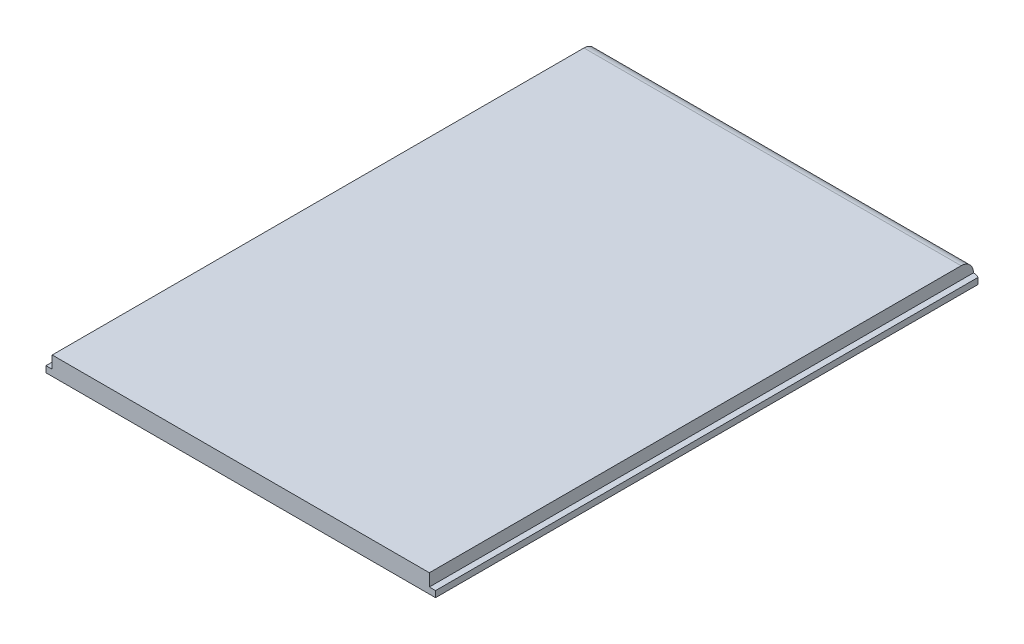
ISO-10303-21;
HEADER;
FILE_DESCRIPTION(('STEP AP214'),'2;1');
FILE_NAME('part.step','',(''),(''),'','','');
FILE_SCHEMA(('AUTOMOTIVE_DESIGN { 1 0 10303 214 1 1 1 1 }'));
ENDSEC;
DATA;
#1=APPLICATION_CONTEXT('core data for automotive mechanical design processes');
#2=APPLICATION_PROTOCOL_DEFINITION('international standard','automotive_design',2000,#1);
#3=PRODUCT_CONTEXT('',#1,'mechanical');
#4=PRODUCT('Part','Part','',(#3));
#5=PRODUCT_RELATED_PRODUCT_CATEGORY('part','',(#4));
#6=PRODUCT_DEFINITION_FORMATION('','',#4);
#7=PRODUCT_DEFINITION_CONTEXT('part definition',#1,'design');
#8=PRODUCT_DEFINITION('design','',#6,#7);
#9=PRODUCT_DEFINITION_SHAPE('','',#8);
#10=(LENGTH_UNIT() NAMED_UNIT(*) SI_UNIT(.MILLI.,.METRE.));
#11=(NAMED_UNIT(*) PLANE_ANGLE_UNIT() SI_UNIT($,.RADIAN.));
#12=(NAMED_UNIT(*) SI_UNIT($,.STERADIAN.) SOLID_ANGLE_UNIT());
#13=UNCERTAINTY_MEASURE_WITH_UNIT(LENGTH_MEASURE(1.E-05),#10,'distance_accuracy_value','');
#14=(GEOMETRIC_REPRESENTATION_CONTEXT(3) GLOBAL_UNCERTAINTY_ASSIGNED_CONTEXT((#13)) GLOBAL_UNIT_ASSIGNED_CONTEXT((#10,
#11,#12)) REPRESENTATION_CONTEXT('',''));
#15=CARTESIAN_POINT('',(0.,0.,0.));
#16=DIRECTION('',(0.,0.,1.));
#17=DIRECTION('',(1.,0.,0.));
#18=AXIS2_PLACEMENT_3D('',#15,#16,#17);
#19=CARTESIAN_POINT('',(-38.735,3.81,-55.88));
#20=DIRECTION('',(0.,0.,1.));
#21=DIRECTION('',(1.,0.,0.));
#22=AXIS2_PLACEMENT_3D('',#19,#20,#21);
#23=PLANE('',#22);
#24=DIRECTION('',(0.,1.,0.));
#25=VECTOR('',#24,1.);
#26=CARTESIAN_POINT('',(38.735,-0.00100000000000013,-55.88));
#27=LINE('',#26,#25);
#28=CARTESIAN_POINT('',(38.735,0.,-55.88));
#29=VERTEX_POINT('',#28);
#30=CARTESIAN_POINT('',(38.735,1.27000000000014,-55.88));
#31=VERTEX_POINT('',#30);
#32=EDGE_CURVE('E112',#29,#31,#27,.T.);
#33=ORIENTED_EDGE('',*,*,#32,.F.);
#34=DIRECTION('',(-1.,0.,0.));
#35=VECTOR('',#34,1.);
#36=CARTESIAN_POINT('',(-38.735,0.,-55.88));
#37=LINE('',#36,#35);
#38=CARTESIAN_POINT('',(-38.735,0.,-55.88));
#39=VERTEX_POINT('',#38);
#40=EDGE_CURVE('E122',#29,#39,#37,.T.);
#41=ORIENTED_EDGE('',*,*,#40,.T.);
#42=DIRECTION('',(0.,1.,0.));
#43=VECTOR('',#42,1.);
#44=CARTESIAN_POINT('',(-38.735,-0.00100000000000013,-55.88));
#45=LINE('',#44,#43);
#46=CARTESIAN_POINT('',(-38.735,1.27,-55.88));
#47=VERTEX_POINT('',#46);
#48=EDGE_CURVE('E178',#39,#47,#45,.T.);
#49=ORIENTED_EDGE('',*,*,#48,.T.);
#50=DIRECTION('',(-1.,0.,0.));
#51=VECTOR('',#50,1.);
#52=CARTESIAN_POINT('',(-38.735,1.27,-55.88));
#53=LINE('',#52,#51);
#54=EDGE_CURVE('E45',#47,#31,#53,.F.);
#55=ORIENTED_EDGE('',*,*,#54,.T.);
#56=EDGE_LOOP('',(#33,#41,#49,#55));
#57=FACE_BOUND('',#56,.T.);
#58=ADVANCED_FACE('F37',(#57),#23,.F.);
#59=CARTESIAN_POINT('',(0.,0.,0.));
#60=DIRECTION('',(0.,-1.,0.));
#61=DIRECTION('',(0.,0.,-1.));
#62=AXIS2_PLACEMENT_3D('',#59,#60,#61);
#63=PLANE('',#62);
#64=ORIENTED_EDGE('',*,*,#40,.F.);
#65=CARTESIAN_POINT('',(38.735,0.,-53.34));
#66=DIRECTION('',(0.,-1.,0.));
#67=DIRECTION('',(0.,0.,-1.));
#68=AXIS2_PLACEMENT_3D('',#65,#66,#67);
#69=CIRCLE('',#68,2.54);
#70=CARTESIAN_POINT('',(40.005,1.45554141656179E-13,-55.5397045256125));
#71=VERTEX_POINT('',#70);
#72=EDGE_CURVE('E107',#71,#29,#69,.F.);
#73=ORIENTED_EDGE('',*,*,#72,.F.);
#74=DIRECTION('',(0.,0.,1.));
#75=VECTOR('',#74,1.);
#76=CARTESIAN_POINT('',(40.005,1.45554141656179E-13,-57.6760512242138));
#77=LINE('',#76,#75);
#78=CARTESIAN_POINT('',(40.005,1.45554141656179E-13,55.88));
#79=VERTEX_POINT('',#78);
#80=EDGE_CURVE('E118',#71,#79,#77,.T.);
#81=ORIENTED_EDGE('',*,*,#80,.T.);
#82=DIRECTION('',(1.,0.,0.));
#83=VECTOR('',#82,1.);
#84=CARTESIAN_POINT('',(-38.735,0.,55.88));
#85=LINE('',#84,#83);
#86=CARTESIAN_POINT('',(-40.005,0.,55.88));
#87=VERTEX_POINT('',#86);
#88=EDGE_CURVE('E157',#87,#79,#85,.T.);
#89=ORIENTED_EDGE('',*,*,#88,.F.);
#90=DIRECTION('',(0.,0.,1.));
#91=VECTOR('',#90,1.);
#92=CARTESIAN_POINT('',(-40.005,0.,-57.6760512242138));
#93=LINE('',#92,#91);
#94=CARTESIAN_POINT('',(-40.005,0.,-55.5397045256125));
#95=VERTEX_POINT('',#94);
#96=EDGE_CURVE('E147',#95,#87,#93,.T.);
#97=ORIENTED_EDGE('',*,*,#96,.F.);
#98=CARTESIAN_POINT('',(-38.735,0.,-53.34));
#99=DIRECTION('',(0.,-1.,0.));
#100=DIRECTION('',(0.,0.,-1.));
#101=AXIS2_PLACEMENT_3D('',#98,#99,#100);
#102=CIRCLE('',#101,2.54);
#103=EDGE_CURVE('E199',#95,#39,#102,.T.);
#104=ORIENTED_EDGE('',*,*,#103,.T.);
#105=EDGE_LOOP('',(#64,#73,#81,#89,#97,#104));
#106=FACE_BOUND('',#105,.T.);
#107=ADVANCED_FACE('F116',(#106),#63,.T.);
#108=CARTESIAN_POINT('',(-38.735,1.27,-57.6760512242138));
#109=DIRECTION('',(0.,1.,0.));
#110=DIRECTION('',(0.,0.,1.));
#111=AXIS2_PLACEMENT_3D('',#108,#109,#110);
#112=PLANE('',#111);
#113=CARTESIAN_POINT('',(-38.735,1.27,-53.34));
#114=DIRECTION('',(0.,1.,0.));
#115=DIRECTION('',(0.,0.,1.));
#116=AXIS2_PLACEMENT_3D('',#113,#114,#115);
#117=CIRCLE('',#116,2.54);
#118=CARTESIAN_POINT('',(-40.005,1.27,-55.5397045256125));
#119=VERTEX_POINT('',#118);
#120=EDGE_CURVE('E201',#47,#119,#117,.T.);
#121=ORIENTED_EDGE('',*,*,#120,.T.);
#122=DIRECTION('',(0.,0.,1.));
#123=VECTOR('',#122,1.);
#124=CARTESIAN_POINT('',(-40.005,1.27,-57.6760512242138));
#125=LINE('',#124,#123);
#126=CARTESIAN_POINT('',(-40.005,1.27,55.88));
#127=VERTEX_POINT('',#126);
#128=EDGE_CURVE('E149',#119,#127,#125,.T.);
#129=ORIENTED_EDGE('',*,*,#128,.T.);
#130=DIRECTION('',(-1.,0.,0.));
#131=VECTOR('',#130,1.);
#132=CARTESIAN_POINT('',(-38.735,1.27,55.88));
#133=LINE('',#132,#131);
#134=CARTESIAN_POINT('',(-38.735,1.27,55.88));
#135=VERTEX_POINT('',#134);
#136=EDGE_CURVE('E140',#135,#127,#133,.T.);
#137=ORIENTED_EDGE('',*,*,#136,.F.);
#138=DIRECTION('',(0.,0.,1.));
#139=VECTOR('',#138,1.);
#140=CARTESIAN_POINT('',(-38.735,1.27,-57.6760512242138));
#141=LINE('',#140,#139);
#142=EDGE_CURVE('E146',#47,#135,#141,.T.);
#143=ORIENTED_EDGE('',*,*,#142,.F.);
#144=EDGE_LOOP('',(#121,#129,#137,#143));
#145=FACE_BOUND('',#144,.T.);
#146=ADVANCED_FACE('F208',(#145),#112,.T.);
#147=CARTESIAN_POINT('',(38.735,1.27000000000014,-57.6760512242138));
#148=DIRECTION('',(0.,1.,0.));
#149=DIRECTION('',(-1.,0.,0.));
#150=AXIS2_PLACEMENT_3D('',#147,#148,#149);
#151=PLANE('',#150);
#152=DIRECTION('',(0.,0.,1.));
#153=VECTOR('',#152,1.);
#154=CARTESIAN_POINT('',(40.005,1.27000000000014,-57.6760512242138));
#155=LINE('',#154,#153);
#156=CARTESIAN_POINT('',(40.005,1.27000000000014,-55.5397045256125));
#157=VERTEX_POINT('',#156);
#158=CARTESIAN_POINT('',(40.005,1.27000000000014,55.88));
#159=VERTEX_POINT('',#158);
#160=EDGE_CURVE('E129',#157,#159,#155,.T.);
#161=ORIENTED_EDGE('',*,*,#160,.F.);
#162=CARTESIAN_POINT('',(38.735,1.27000000000014,-53.34));
#163=DIRECTION('',(0.,1.,0.));
#164=DIRECTION('',(-1.,0.,0.));
#165=AXIS2_PLACEMENT_3D('',#162,#163,#164);
#166=CIRCLE('',#165,2.54);
#167=EDGE_CURVE('E60',#31,#157,#166,.F.);
#168=ORIENTED_EDGE('',*,*,#167,.F.);
#169=DIRECTION('',(0.,0.,1.));
#170=VECTOR('',#169,1.);
#171=CARTESIAN_POINT('',(38.735,1.27000000000014,-57.6760512242138));
#172=LINE('',#171,#170);
#173=CARTESIAN_POINT('',(38.735,1.27000000000014,55.88));
#174=VERTEX_POINT('',#173);
#175=EDGE_CURVE('E128',#31,#174,#172,.T.);
#176=ORIENTED_EDGE('',*,*,#175,.T.);
#177=DIRECTION('',(-1.,0.,0.));
#178=VECTOR('',#177,1.);
#179=CARTESIAN_POINT('',(38.735,1.27000000000014,55.88));
#180=LINE('',#179,#178);
#181=EDGE_CURVE('E137',#159,#174,#180,.T.);
#182=ORIENTED_EDGE('',*,*,#181,.F.);
#183=EDGE_LOOP('',(#161,#168,#176,#182));
#184=FACE_BOUND('',#183,.T.);
#185=ADVANCED_FACE('F198',(#184),#151,.T.);
#186=CARTESIAN_POINT('',(40.005,1.27000000000014,-57.6760512242138));
#187=DIRECTION('',(1.,0.,0.));
#188=DIRECTION('',(0.,0.,-1.));
#189=AXIS2_PLACEMENT_3D('',#186,#187,#188);
#190=PLANE('',#189);
#191=ORIENTED_EDGE('',*,*,#80,.F.);
#192=DIRECTION('',(0.,1.,0.));
#193=VECTOR('',#192,1.);
#194=CARTESIAN_POINT('',(40.005,-0.00100000000000013,-55.5397045256125));
#195=LINE('',#194,#193);
#196=EDGE_CURVE('E104',#71,#157,#195,.T.);
#197=ORIENTED_EDGE('',*,*,#196,.T.);
#198=ORIENTED_EDGE('',*,*,#160,.T.);
#199=DIRECTION('',(0.,1.,0.));
#200=VECTOR('',#199,1.);
#201=CARTESIAN_POINT('',(40.005,1.27000000000014,55.88));
#202=LINE('',#201,#200);
#203=EDGE_CURVE('E127',#79,#159,#202,.T.);
#204=ORIENTED_EDGE('',*,*,#203,.F.);
#205=EDGE_LOOP('',(#191,#197,#198,#204));
#206=FACE_BOUND('',#205,.T.);
#207=ADVANCED_FACE('F125',(#206),#190,.T.);
#208=CARTESIAN_POINT('',(38.735,3.81,55.88));
#209=DIRECTION('',(-1.,0.,0.));
#210=DIRECTION('',(0.,0.,1.));
#211=AXIS2_PLACEMENT_3D('',#208,#209,#210);
#212=PLANE('',#211);
#213=ORIENTED_EDGE('',*,*,#175,.F.);
#214=CARTESIAN_POINT('',(38.735,1.27,-53.34));
#215=DIRECTION('',(-1.,0.,0.));
#216=DIRECTION('',(0.,0.,1.));
#217=AXIS2_PLACEMENT_3D('',#214,#215,#216);
#218=CIRCLE('',#217,2.54);
#219=CARTESIAN_POINT('',(38.735,3.81,-53.34));
#220=VERTEX_POINT('',#219);
#221=EDGE_CURVE('E11',#31,#220,#218,.F.);
#222=ORIENTED_EDGE('',*,*,#221,.T.);
#223=DIRECTION('',(0.,0.,-1.));
#224=VECTOR('',#223,1.);
#225=CARTESIAN_POINT('',(38.735,3.81,55.88));
#226=LINE('',#225,#224);
#227=CARTESIAN_POINT('',(38.735,3.81,55.88));
#228=VERTEX_POINT('',#227);
#229=EDGE_CURVE('E153',#228,#220,#226,.T.);
#230=ORIENTED_EDGE('',*,*,#229,.F.);
#231=DIRECTION('',(0.,-1.,0.));
#232=VECTOR('',#231,1.);
#233=CARTESIAN_POINT('',(38.735,3.81,55.88));
#234=LINE('',#233,#232);
#235=EDGE_CURVE('E161',#228,#174,#234,.T.);
#236=ORIENTED_EDGE('',*,*,#235,.T.);
#237=EDGE_LOOP('',(#213,#222,#230,#236));
#238=FACE_BOUND('',#237,.T.);
#239=ADVANCED_FACE('F182',(#238),#212,.F.);
#240=CARTESIAN_POINT('',(-38.735,3.81,55.88));
#241=DIRECTION('',(1.,0.,0.));
#242=DIRECTION('',(0.,0.,-1.));
#243=AXIS2_PLACEMENT_3D('',#240,#241,#242);
#244=PLANE('',#243);
#245=DIRECTION('',(0.,0.,1.));
#246=VECTOR('',#245,1.);
#247=CARTESIAN_POINT('',(-38.735,3.81,55.88));
#248=LINE('',#247,#246);
#249=CARTESIAN_POINT('',(-38.735,3.81,-53.34));
#250=VERTEX_POINT('',#249);
#251=CARTESIAN_POINT('',(-38.735,3.81,55.88));
#252=VERTEX_POINT('',#251);
#253=EDGE_CURVE('E156',#250,#252,#248,.T.);
#254=ORIENTED_EDGE('',*,*,#253,.F.);
#255=CARTESIAN_POINT('',(-38.735,1.27,-53.34));
#256=DIRECTION('',(1.,0.,0.));
#257=DIRECTION('',(0.,0.,-1.));
#258=AXIS2_PLACEMENT_3D('',#255,#256,#257);
#259=CIRCLE('',#258,2.54);
#260=EDGE_CURVE('E171',#250,#47,#259,.F.);
#261=ORIENTED_EDGE('',*,*,#260,.T.);
#262=ORIENTED_EDGE('',*,*,#142,.T.);
#263=DIRECTION('',(0.,-1.,0.));
#264=VECTOR('',#263,1.);
#265=CARTESIAN_POINT('',(-38.735,3.81,55.88));
#266=LINE('',#265,#264);
#267=EDGE_CURVE('E165',#252,#135,#266,.T.);
#268=ORIENTED_EDGE('',*,*,#267,.F.);
#269=EDGE_LOOP('',(#254,#261,#262,#268));
#270=FACE_BOUND('',#269,.T.);
#271=ADVANCED_FACE('F193',(#270),#244,.F.);
#272=CARTESIAN_POINT('',(-38.735,3.81,55.88));
#273=DIRECTION('',(0.,0.,-1.));
#274=DIRECTION('',(-1.,0.,0.));
#275=AXIS2_PLACEMENT_3D('',#272,#273,#274);
#276=PLANE('',#275);
#277=ORIENTED_EDGE('',*,*,#88,.T.);
#278=ORIENTED_EDGE('',*,*,#203,.T.);
#279=ORIENTED_EDGE('',*,*,#181,.T.);
#280=ORIENTED_EDGE('',*,*,#235,.F.);
#281=DIRECTION('',(1.,0.,0.));
#282=VECTOR('',#281,1.);
#283=CARTESIAN_POINT('',(-38.735,3.81,55.88));
#284=LINE('',#283,#282);
#285=EDGE_CURVE('E159',#252,#228,#284,.T.);
#286=ORIENTED_EDGE('',*,*,#285,.F.);
#287=ORIENTED_EDGE('',*,*,#267,.T.);
#288=ORIENTED_EDGE('',*,*,#136,.T.);
#289=DIRECTION('',(0.,-1.,0.));
#290=VECTOR('',#289,1.);
#291=CARTESIAN_POINT('',(-40.005,1.27,55.88));
#292=LINE('',#291,#290);
#293=EDGE_CURVE('E143',#127,#87,#292,.T.);
#294=ORIENTED_EDGE('',*,*,#293,.T.);
#295=EDGE_LOOP('',(#277,#278,#279,#280,#286,#287,#288,#294));
#296=FACE_BOUND('',#295,.T.);
#297=ADVANCED_FACE('F197',(#296),#276,.F.);
#298=CARTESIAN_POINT('',(0.,3.81,0.));
#299=DIRECTION('',(0.,-1.,0.));
#300=DIRECTION('',(0.,0.,-1.));
#301=AXIS2_PLACEMENT_3D('',#298,#299,#300);
#302=PLANE('',#301);
#303=ORIENTED_EDGE('',*,*,#229,.T.);
#304=DIRECTION('',(-1.,0.,0.));
#305=VECTOR('',#304,1.);
#306=CARTESIAN_POINT('',(0.,3.81,-53.34));
#307=LINE('',#306,#305);
#308=EDGE_CURVE('E168',#220,#250,#307,.T.);
#309=ORIENTED_EDGE('',*,*,#308,.T.);
#310=ORIENTED_EDGE('',*,*,#253,.T.);
#311=ORIENTED_EDGE('',*,*,#285,.T.);
#312=EDGE_LOOP('',(#303,#309,#310,#311));
#313=FACE_BOUND('',#312,.T.);
#314=ADVANCED_FACE('F190',(#313),#302,.F.);
#315=CARTESIAN_POINT('',(-40.005,1.27,-57.6760512242138));
#316=DIRECTION('',(-1.,0.,0.));
#317=DIRECTION('',(0.,0.,1.));
#318=AXIS2_PLACEMENT_3D('',#315,#316,#317);
#319=PLANE('',#318);
#320=DIRECTION('',(0.,1.,0.));
#321=VECTOR('',#320,1.);
#322=CARTESIAN_POINT('',(-40.005,-0.00100000000000013,-55.5397045256125));
#323=LINE('',#322,#321);
#324=EDGE_CURVE('E52',#95,#119,#323,.T.);
#325=ORIENTED_EDGE('',*,*,#324,.F.);
#326=ORIENTED_EDGE('',*,*,#96,.T.);
#327=ORIENTED_EDGE('',*,*,#293,.F.);
#328=ORIENTED_EDGE('',*,*,#128,.F.);
#329=EDGE_LOOP('',(#325,#326,#327,#328));
#330=FACE_BOUND('',#329,.T.);
#331=ADVANCED_FACE('F211',(#330),#319,.T.);
#332=CARTESIAN_POINT('',(0.,1.27,-53.34));
#333=DIRECTION('',(-1.,0.,0.));
#334=DIRECTION('',(0.,0.,1.));
#335=AXIS2_PLACEMENT_3D('',#332,#333,#334);
#336=CYLINDRICAL_SURFACE('',#335,2.54);
#337=ORIENTED_EDGE('',*,*,#221,.F.);
#338=ORIENTED_EDGE('',*,*,#54,.F.);
#339=ORIENTED_EDGE('',*,*,#260,.F.);
#340=ORIENTED_EDGE('',*,*,#308,.F.);
#341=EDGE_LOOP('',(#337,#338,#339,#340));
#342=FACE_BOUND('',#341,.T.);
#343=ADVANCED_FACE('F39',(#342),#336,.T.);
#344=CARTESIAN_POINT('',(38.735,-0.00100000000000013,-53.34));
#345=DIRECTION('',(0.,1.,0.));
#346=DIRECTION('',(0.,0.,1.));
#347=AXIS2_PLACEMENT_3D('',#344,#345,#346);
#348=CYLINDRICAL_SURFACE('',#347,2.54);
#349=ORIENTED_EDGE('',*,*,#72,.T.);
#350=ORIENTED_EDGE('',*,*,#32,.T.);
#351=ORIENTED_EDGE('',*,*,#167,.T.);
#352=ORIENTED_EDGE('',*,*,#196,.F.);
#353=EDGE_LOOP('',(#349,#350,#351,#352));
#354=FACE_BOUND('',#353,.T.);
#355=ADVANCED_FACE('F106',(#354),#348,.T.);
#356=CARTESIAN_POINT('',(-38.735,-0.00100000000000013,-53.34));
#357=DIRECTION('',(0.,1.,0.));
#358=DIRECTION('',(0.,0.,1.));
#359=AXIS2_PLACEMENT_3D('',#356,#357,#358);
#360=CYLINDRICAL_SURFACE('',#359,2.54);
#361=ORIENTED_EDGE('',*,*,#324,.T.);
#362=ORIENTED_EDGE('',*,*,#120,.F.);
#363=ORIENTED_EDGE('',*,*,#48,.F.);
#364=ORIENTED_EDGE('',*,*,#103,.F.);
#365=EDGE_LOOP('',(#361,#362,#363,#364));
#366=FACE_BOUND('',#365,.T.);
#367=ADVANCED_FACE('F213',(#366),#360,.T.);
#368=CLOSED_SHELL('',(#58,#107,#146,#185,#207,#239,#271,#297,#314,#331,#343,#355,#367));
#369=MANIFOLD_SOLID_BREP('B2',#368);
#370=ADVANCED_BREP_SHAPE_REPRESENTATION('',(#18,#369),#14);
#371=SHAPE_DEFINITION_REPRESENTATION(#9,#370);
ENDSEC;
END-ISO-10303-21;
